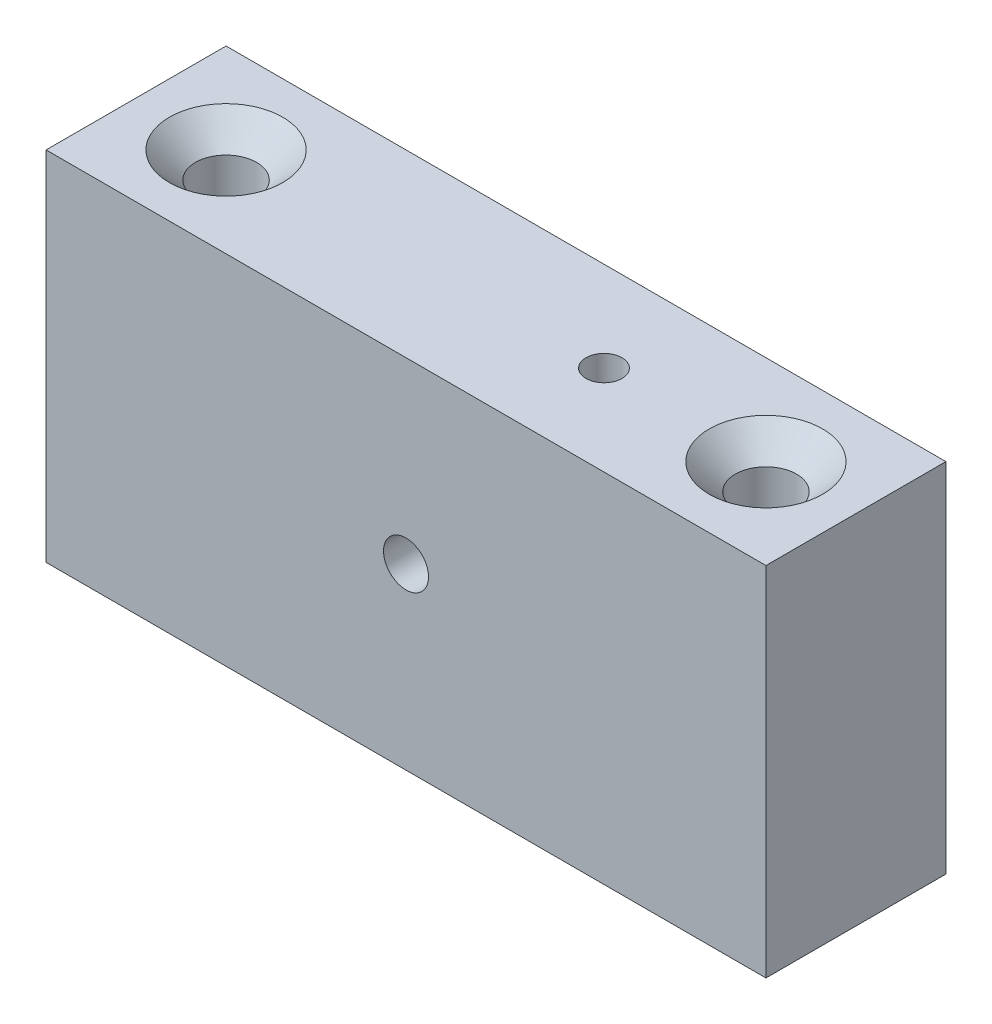
ISO-10303-21;
HEADER;
FILE_DESCRIPTION(('STEP AP214'),'2;1');
FILE_NAME('part.step','',(''),(''),'','','');
FILE_SCHEMA(('AUTOMOTIVE_DESIGN { 1 0 10303 214 1 1 1 1 }'));
ENDSEC;
DATA;
#1=APPLICATION_CONTEXT('core data for automotive mechanical design processes');
#2=APPLICATION_PROTOCOL_DEFINITION('international standard','automotive_design',2000,#1);
#3=PRODUCT_CONTEXT('',#1,'mechanical');
#4=PRODUCT('Part','Part','',(#3));
#5=PRODUCT_RELATED_PRODUCT_CATEGORY('part','',(#4));
#6=PRODUCT_DEFINITION_FORMATION('','',#4);
#7=PRODUCT_DEFINITION_CONTEXT('part definition',#1,'design');
#8=PRODUCT_DEFINITION('design','',#6,#7);
#9=PRODUCT_DEFINITION_SHAPE('','',#8);
#10=(LENGTH_UNIT() NAMED_UNIT(*) SI_UNIT(.MILLI.,.METRE.));
#11=(NAMED_UNIT(*) PLANE_ANGLE_UNIT() SI_UNIT($,.RADIAN.));
#12=(NAMED_UNIT(*) SI_UNIT($,.STERADIAN.) SOLID_ANGLE_UNIT());
#13=UNCERTAINTY_MEASURE_WITH_UNIT(LENGTH_MEASURE(1.E-05),#10,'distance_accuracy_value','');
#14=(GEOMETRIC_REPRESENTATION_CONTEXT(3) GLOBAL_UNCERTAINTY_ASSIGNED_CONTEXT((#13)) GLOBAL_UNIT_ASSIGNED_CONTEXT((#10,
#11,#12)) REPRESENTATION_CONTEXT('',''));
#15=CARTESIAN_POINT('',(0.,0.,0.));
#16=DIRECTION('',(0.,0.,1.));
#17=DIRECTION('',(1.,0.,0.));
#18=AXIS2_PLACEMENT_3D('',#15,#16,#17);
#19=CARTESIAN_POINT('',(0.,0.,0.));
#20=DIRECTION('',(0.,-1.,0.));
#21=DIRECTION('',(0.,0.,-1.));
#22=AXIS2_PLACEMENT_3D('',#19,#20,#21);
#23=PLANE('',#22);
#24=DIRECTION('',(0.,0.,1.));
#25=VECTOR('',#24,1.);
#26=CARTESIAN_POINT('',(0.,0.,0.));
#27=LINE('',#26,#25);
#28=CARTESIAN_POINT('',(0.,0.,-10.));
#29=VERTEX_POINT('',#28);
#30=CARTESIAN_POINT('',(0.,0.,0.));
#31=VERTEX_POINT('',#30);
#32=EDGE_CURVE('E100',#29,#31,#27,.T.);
#33=ORIENTED_EDGE('',*,*,#32,.F.);
#34=DIRECTION('',(-1.,0.,0.));
#35=VECTOR('',#34,1.);
#36=CARTESIAN_POINT('',(0.,0.,-10.));
#37=LINE('',#36,#35);
#38=CARTESIAN_POINT('',(40.,0.,-10.));
#39=VERTEX_POINT('',#38);
#40=EDGE_CURVE('E75',#39,#29,#37,.T.);
#41=ORIENTED_EDGE('',*,*,#40,.F.);
#42=DIRECTION('',(0.,0.,-1.));
#43=VECTOR('',#42,1.);
#44=CARTESIAN_POINT('',(40.,0.,0.));
#45=LINE('',#44,#43);
#46=CARTESIAN_POINT('',(40.,0.,0.));
#47=VERTEX_POINT('',#46);
#48=EDGE_CURVE('E69',#47,#39,#45,.T.);
#49=ORIENTED_EDGE('',*,*,#48,.F.);
#50=DIRECTION('',(1.,0.,0.));
#51=VECTOR('',#50,1.);
#52=CARTESIAN_POINT('',(0.,0.,0.));
#53=LINE('',#52,#51);
#54=EDGE_CURVE('E92',#31,#47,#53,.T.);
#55=ORIENTED_EDGE('',*,*,#54,.F.);
#56=EDGE_LOOP('',(#33,#41,#49,#55));
#57=FACE_BOUND('',#56,.T.);
#58=CARTESIAN_POINT('',(35.,0.,-5.));
#59=DIRECTION('',(0.,1.,0.));
#60=DIRECTION('',(0.,0.,1.));
#61=AXIS2_PLACEMENT_3D('',#58,#59,#60);
#62=CIRCLE('',#61,1.69999999999999);
#63=CARTESIAN_POINT('',(35.,0.,-3.30000000000001));
#64=VERTEX_POINT('',#63);
#65=EDGE_CURVE('E103',#64,#64,#62,.T.);
#66=ORIENTED_EDGE('',*,*,#65,.T.);
#67=EDGE_LOOP('',(#66));
#68=FACE_BOUND('',#67,.T.);
#69=CARTESIAN_POINT('',(5.,0.,-5.));
#70=DIRECTION('',(0.,1.,0.));
#71=DIRECTION('',(0.,0.,1.));
#72=AXIS2_PLACEMENT_3D('',#69,#70,#71);
#73=CIRCLE('',#72,1.7);
#74=CARTESIAN_POINT('',(5.,0.,-3.3));
#75=VERTEX_POINT('',#74);
#76=EDGE_CURVE('E122',#75,#75,#73,.T.);
#77=ORIENTED_EDGE('',*,*,#76,.T.);
#78=EDGE_LOOP('',(#77));
#79=FACE_BOUND('',#78,.T.);
#80=CARTESIAN_POINT('',(26.,0.,-5.));
#81=DIRECTION('',(0.,1.,0.));
#82=DIRECTION('',(0.,0.,1.));
#83=AXIS2_PLACEMENT_3D('',#80,#81,#82);
#84=CIRCLE('',#83,0.999999999999997);
#85=CARTESIAN_POINT('',(26.,0.,-4.));
#86=VERTEX_POINT('',#85);
#87=EDGE_CURVE('E137',#86,#86,#84,.T.);
#88=ORIENTED_EDGE('',*,*,#87,.T.);
#89=EDGE_LOOP('',(#88));
#90=FACE_BOUND('',#89,.T.);
#91=ADVANCED_FACE('F35',(#57,#68,#79,#90),#23,.T.);
#92=CARTESIAN_POINT('',(0.,19.85,0.));
#93=DIRECTION('',(0.,-1.,0.));
#94=DIRECTION('',(0.,0.,-1.));
#95=AXIS2_PLACEMENT_3D('',#92,#93,#94);
#96=PLANE('',#95);
#97=CARTESIAN_POINT('',(26.,19.85,-5.));
#98=DIRECTION('',(0.,1.,0.));
#99=DIRECTION('',(0.,0.,1.));
#100=AXIS2_PLACEMENT_3D('',#97,#98,#99);
#101=CIRCLE('',#100,0.999999999999997);
#102=CARTESIAN_POINT('',(26.,19.85,-4.));
#103=VERTEX_POINT('',#102);
#104=EDGE_CURVE('E140',#103,#103,#101,.T.);
#105=ORIENTED_EDGE('',*,*,#104,.F.);
#106=EDGE_LOOP('',(#105));
#107=FACE_BOUND('',#106,.T.);
#108=CARTESIAN_POINT('',(35.,19.85,-5.));
#109=DIRECTION('',(0.,1.,0.));
#110=DIRECTION('',(0.,0.,1.));
#111=AXIS2_PLACEMENT_3D('',#108,#109,#110);
#112=CIRCLE('',#111,3.15);
#113=CARTESIAN_POINT('',(35.,19.85,-1.85));
#114=VERTEX_POINT('',#113);
#115=EDGE_CURVE('E119',#114,#114,#112,.T.);
#116=ORIENTED_EDGE('',*,*,#115,.F.);
#117=EDGE_LOOP('',(#116));
#118=FACE_BOUND('',#117,.T.);
#119=DIRECTION('',(0.,0.,1.));
#120=VECTOR('',#119,1.);
#121=CARTESIAN_POINT('',(0.,19.85,0.));
#122=LINE('',#121,#120);
#123=CARTESIAN_POINT('',(0.,19.85,-10.));
#124=VERTEX_POINT('',#123);
#125=CARTESIAN_POINT('',(0.,19.85,0.));
#126=VERTEX_POINT('',#125);
#127=EDGE_CURVE('E88',#124,#126,#122,.T.);
#128=ORIENTED_EDGE('',*,*,#127,.T.);
#129=DIRECTION('',(1.,0.,0.));
#130=VECTOR('',#129,1.);
#131=CARTESIAN_POINT('',(0.,19.85,0.));
#132=LINE('',#131,#130);
#133=CARTESIAN_POINT('',(40.,19.85,0.));
#134=VERTEX_POINT('',#133);
#135=EDGE_CURVE('E82',#126,#134,#132,.T.);
#136=ORIENTED_EDGE('',*,*,#135,.T.);
#137=DIRECTION('',(0.,0.,-1.));
#138=VECTOR('',#137,1.);
#139=CARTESIAN_POINT('',(40.,19.85,0.));
#140=LINE('',#139,#138);
#141=CARTESIAN_POINT('',(40.,19.85,-10.));
#142=VERTEX_POINT('',#141);
#143=EDGE_CURVE('E86',#134,#142,#140,.T.);
#144=ORIENTED_EDGE('',*,*,#143,.T.);
#145=DIRECTION('',(-1.,0.,0.));
#146=VECTOR('',#145,1.);
#147=CARTESIAN_POINT('',(0.,19.85,-10.));
#148=LINE('',#147,#146);
#149=EDGE_CURVE('E52',#142,#124,#148,.T.);
#150=ORIENTED_EDGE('',*,*,#149,.T.);
#151=EDGE_LOOP('',(#128,#136,#144,#150));
#152=FACE_BOUND('',#151,.T.);
#153=CARTESIAN_POINT('',(5.,19.85,-5.));
#154=DIRECTION('',(0.,1.,0.));
#155=DIRECTION('',(0.,0.,1.));
#156=AXIS2_PLACEMENT_3D('',#153,#154,#155);
#157=CIRCLE('',#156,3.15);
#158=CARTESIAN_POINT('',(5.,19.85,-1.85));
#159=VERTEX_POINT('',#158);
#160=EDGE_CURVE('E128',#159,#159,#157,.T.);
#161=ORIENTED_EDGE('',*,*,#160,.F.);
#162=EDGE_LOOP('',(#161));
#163=FACE_BOUND('',#162,.T.);
#164=ADVANCED_FACE('F83',(#107,#118,#152,#163),#96,.F.);
#165=CARTESIAN_POINT('',(0.,19.85,0.));
#166=DIRECTION('',(1.,0.,0.));
#167=DIRECTION('',(0.,0.,-1.));
#168=AXIS2_PLACEMENT_3D('',#165,#166,#167);
#169=PLANE('',#168);
#170=ORIENTED_EDGE('',*,*,#32,.T.);
#171=DIRECTION('',(0.,-1.,0.));
#172=VECTOR('',#171,1.);
#173=CARTESIAN_POINT('',(0.,19.85,0.));
#174=LINE('',#173,#172);
#175=EDGE_CURVE('E11',#126,#31,#174,.T.);
#176=ORIENTED_EDGE('',*,*,#175,.F.);
#177=ORIENTED_EDGE('',*,*,#127,.F.);
#178=DIRECTION('',(0.,-1.,0.));
#179=VECTOR('',#178,1.);
#180=CARTESIAN_POINT('',(0.,19.85,-10.));
#181=LINE('',#180,#179);
#182=EDGE_CURVE('E96',#124,#29,#181,.T.);
#183=ORIENTED_EDGE('',*,*,#182,.T.);
#184=EDGE_LOOP('',(#170,#176,#177,#183));
#185=FACE_BOUND('',#184,.T.);
#186=ADVANCED_FACE('F37',(#185),#169,.F.);
#187=CARTESIAN_POINT('',(0.,19.85,0.));
#188=DIRECTION('',(0.,0.,-1.));
#189=DIRECTION('',(-1.,0.,0.));
#190=AXIS2_PLACEMENT_3D('',#187,#188,#189);
#191=PLANE('',#190);
#192=CARTESIAN_POINT('',(20.,9.92500000000001,0.));
#193=DIRECTION('',(0.,0.,-1.));
#194=DIRECTION('',(-1.,0.,0.));
#195=AXIS2_PLACEMENT_3D('',#192,#193,#194);
#196=CIRCLE('',#195,1.25);
#197=CARTESIAN_POINT('',(18.75,9.92500000000001,0.));
#198=VERTEX_POINT('',#197);
#199=EDGE_CURVE('E131',#198,#198,#196,.T.);
#200=ORIENTED_EDGE('',*,*,#199,.T.);
#201=EDGE_LOOP('',(#200));
#202=FACE_BOUND('',#201,.T.);
#203=ORIENTED_EDGE('',*,*,#54,.T.);
#204=DIRECTION('',(0.,-1.,0.));
#205=VECTOR('',#204,1.);
#206=CARTESIAN_POINT('',(40.,19.85,0.));
#207=LINE('',#206,#205);
#208=EDGE_CURVE('E44',#134,#47,#207,.T.);
#209=ORIENTED_EDGE('',*,*,#208,.F.);
#210=ORIENTED_EDGE('',*,*,#135,.F.);
#211=ORIENTED_EDGE('',*,*,#175,.T.);
#212=EDGE_LOOP('',(#203,#209,#210,#211));
#213=FACE_BOUND('',#212,.T.);
#214=ADVANCED_FACE('F91',(#202,#213),#191,.F.);
#215=CARTESIAN_POINT('',(40.,19.85,0.));
#216=DIRECTION('',(-1.,0.,0.));
#217=DIRECTION('',(0.,0.,1.));
#218=AXIS2_PLACEMENT_3D('',#215,#216,#217);
#219=PLANE('',#218);
#220=ORIENTED_EDGE('',*,*,#48,.T.);
#221=DIRECTION('',(0.,-1.,0.));
#222=VECTOR('',#221,1.);
#223=CARTESIAN_POINT('',(40.,19.85,-10.));
#224=LINE('',#223,#222);
#225=EDGE_CURVE('E93',#142,#39,#224,.T.);
#226=ORIENTED_EDGE('',*,*,#225,.F.);
#227=ORIENTED_EDGE('',*,*,#143,.F.);
#228=ORIENTED_EDGE('',*,*,#208,.T.);
#229=EDGE_LOOP('',(#220,#226,#227,#228));
#230=FACE_BOUND('',#229,.T.);
#231=ADVANCED_FACE('F94',(#230),#219,.F.);
#232=CARTESIAN_POINT('',(0.,19.85,-10.));
#233=DIRECTION('',(0.,0.,1.));
#234=DIRECTION('',(1.,0.,0.));
#235=AXIS2_PLACEMENT_3D('',#232,#233,#234);
#236=PLANE('',#235);
#237=CARTESIAN_POINT('',(20.,9.92500000000001,-10.));
#238=DIRECTION('',(0.,0.,-1.));
#239=DIRECTION('',(-1.,0.,0.));
#240=AXIS2_PLACEMENT_3D('',#237,#238,#239);
#241=CIRCLE('',#240,1.25);
#242=CARTESIAN_POINT('',(18.75,9.92500000000001,-10.));
#243=VERTEX_POINT('',#242);
#244=EDGE_CURVE('E134',#243,#243,#241,.T.);
#245=ORIENTED_EDGE('',*,*,#244,.F.);
#246=EDGE_LOOP('',(#245));
#247=FACE_BOUND('',#246,.T.);
#248=ORIENTED_EDGE('',*,*,#40,.T.);
#249=ORIENTED_EDGE('',*,*,#182,.F.);
#250=ORIENTED_EDGE('',*,*,#149,.F.);
#251=ORIENTED_EDGE('',*,*,#225,.T.);
#252=EDGE_LOOP('',(#248,#249,#250,#251));
#253=FACE_BOUND('',#252,.T.);
#254=ADVANCED_FACE('F108',(#247,#253),#236,.F.);
#255=CARTESIAN_POINT('',(35.,19.85,-5.));
#256=DIRECTION('',(0.,1.,0.));
#257=DIRECTION('',(0.,0.,1.));
#258=AXIS2_PLACEMENT_3D('',#255,#256,#257);
#259=CYLINDRICAL_SURFACE('',#258,1.7);
#260=ORIENTED_EDGE('',*,*,#65,.F.);
#261=EDGE_LOOP('',(#260));
#262=FACE_BOUND('',#261,.T.);
#263=CARTESIAN_POINT('',(35.,18.4,-5.));
#264=DIRECTION('',(0.,1.,0.));
#265=DIRECTION('',(0.,0.,1.));
#266=AXIS2_PLACEMENT_3D('',#263,#264,#265);
#267=CIRCLE('',#266,1.7);
#268=CARTESIAN_POINT('',(35.,18.4,-3.3));
#269=VERTEX_POINT('',#268);
#270=EDGE_CURVE('E116',#269,#269,#267,.T.);
#271=ORIENTED_EDGE('',*,*,#270,.T.);
#272=EDGE_LOOP('',(#271));
#273=FACE_BOUND('',#272,.T.);
#274=ADVANCED_FACE('F154',(#262,#273),#259,.F.);
#275=CARTESIAN_POINT('',(35.,19.85,-5.));
#276=DIRECTION('',(0.,1.,0.));
#277=DIRECTION('',(0.,0.,1.));
#278=AXIS2_PLACEMENT_3D('',#275,#276,#277);
#279=CONICAL_SURFACE('',#278,3.15,0.785398163397446);
#280=ORIENTED_EDGE('',*,*,#270,.F.);
#281=EDGE_LOOP('',(#280));
#282=FACE_BOUND('',#281,.T.);
#283=ORIENTED_EDGE('',*,*,#115,.T.);
#284=EDGE_LOOP('',(#283));
#285=FACE_BOUND('',#284,.T.);
#286=ADVANCED_FACE('F151',(#282,#285),#279,.F.);
#287=CARTESIAN_POINT('',(5.,19.85,-5.));
#288=DIRECTION('',(0.,1.,0.));
#289=DIRECTION('',(0.,0.,1.));
#290=AXIS2_PLACEMENT_3D('',#287,#288,#289);
#291=CYLINDRICAL_SURFACE('',#290,1.7);
#292=ORIENTED_EDGE('',*,*,#76,.F.);
#293=EDGE_LOOP('',(#292));
#294=FACE_BOUND('',#293,.T.);
#295=CARTESIAN_POINT('',(5.,18.4,-5.));
#296=DIRECTION('',(0.,1.,0.));
#297=DIRECTION('',(0.,0.,1.));
#298=AXIS2_PLACEMENT_3D('',#295,#296,#297);
#299=CIRCLE('',#298,1.7);
#300=CARTESIAN_POINT('',(5.,18.4,-3.3));
#301=VERTEX_POINT('',#300);
#302=EDGE_CURVE('E125',#301,#301,#299,.T.);
#303=ORIENTED_EDGE('',*,*,#302,.T.);
#304=EDGE_LOOP('',(#303));
#305=FACE_BOUND('',#304,.T.);
#306=ADVANCED_FACE('F153',(#294,#305),#291,.F.);
#307=CARTESIAN_POINT('',(5.,19.85,-5.));
#308=DIRECTION('',(0.,1.,0.));
#309=DIRECTION('',(0.,0.,1.));
#310=AXIS2_PLACEMENT_3D('',#307,#308,#309);
#311=CONICAL_SURFACE('',#310,3.15,0.785398163397447);
#312=ORIENTED_EDGE('',*,*,#302,.F.);
#313=EDGE_LOOP('',(#312));
#314=FACE_BOUND('',#313,.T.);
#315=ORIENTED_EDGE('',*,*,#160,.T.);
#316=EDGE_LOOP('',(#315));
#317=FACE_BOUND('',#316,.T.);
#318=ADVANCED_FACE('F161',(#314,#317),#311,.F.);
#319=CARTESIAN_POINT('',(20.,9.92500000000001,-10.));
#320=DIRECTION('',(0.,0.,-1.));
#321=DIRECTION('',(-1.,0.,0.));
#322=AXIS2_PLACEMENT_3D('',#319,#320,#321);
#323=CYLINDRICAL_SURFACE('',#322,1.25);
#324=ORIENTED_EDGE('',*,*,#199,.F.);
#325=EDGE_LOOP('',(#324));
#326=FACE_BOUND('',#325,.T.);
#327=ORIENTED_EDGE('',*,*,#244,.T.);
#328=EDGE_LOOP('',(#327));
#329=FACE_BOUND('',#328,.T.);
#330=ADVANCED_FACE('F183',(#326,#329),#323,.F.);
#331=CARTESIAN_POINT('',(26.,19.85,-5.));
#332=DIRECTION('',(0.,1.,0.));
#333=DIRECTION('',(0.,0.,1.));
#334=AXIS2_PLACEMENT_3D('',#331,#332,#333);
#335=CYLINDRICAL_SURFACE('',#334,0.999999999999997);
#336=ORIENTED_EDGE('',*,*,#87,.F.);
#337=EDGE_LOOP('',(#336));
#338=FACE_BOUND('',#337,.T.);
#339=ORIENTED_EDGE('',*,*,#104,.T.);
#340=EDGE_LOOP('',(#339));
#341=FACE_BOUND('',#340,.T.);
#342=ADVANCED_FACE('F144',(#338,#341),#335,.F.);
#343=CLOSED_SHELL('',(#91,#164,#186,#214,#231,#254,#274,#286,#306,#318,#330,#342));
#344=MANIFOLD_SOLID_BREP('B2',#343);
#345=ADVANCED_BREP_SHAPE_REPRESENTATION('',(#18,#344),#14);
#346=SHAPE_DEFINITION_REPRESENTATION(#9,#345);
ENDSEC;
END-ISO-10303-21;
